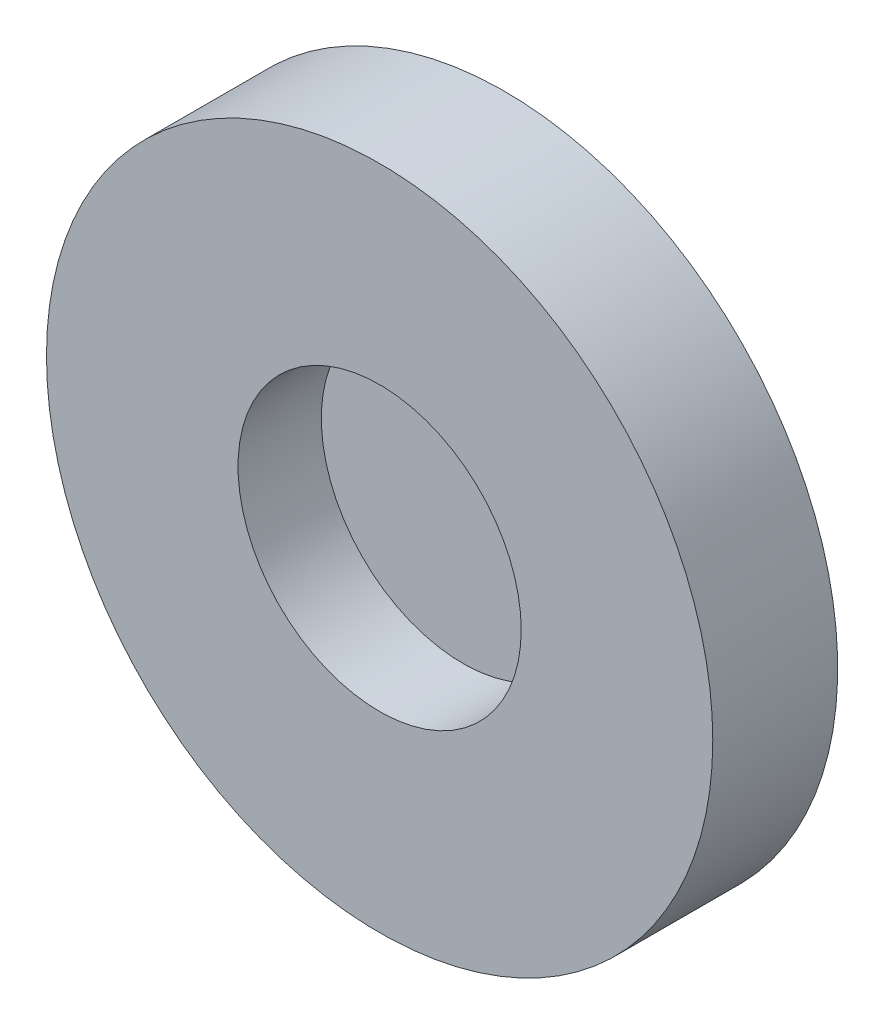
ISO-10303-21;
HEADER;
FILE_DESCRIPTION(('STEP AP214'),'2;1');
FILE_NAME('part.step','',(''),(''),'','','');
FILE_SCHEMA(('AUTOMOTIVE_DESIGN { 1 0 10303 214 1 1 1 1 }'));
ENDSEC;
DATA;
#1=APPLICATION_CONTEXT('core data for automotive mechanical design processes');
#2=APPLICATION_PROTOCOL_DEFINITION('international standard','automotive_design',2000,#1);
#3=PRODUCT_CONTEXT('',#1,'mechanical');
#4=PRODUCT('Part','Part','',(#3));
#5=PRODUCT_RELATED_PRODUCT_CATEGORY('part','',(#4));
#6=PRODUCT_DEFINITION_FORMATION('','',#4);
#7=PRODUCT_DEFINITION_CONTEXT('part definition',#1,'design');
#8=PRODUCT_DEFINITION('design','',#6,#7);
#9=PRODUCT_DEFINITION_SHAPE('','',#8);
#10=(LENGTH_UNIT() NAMED_UNIT(*) SI_UNIT(.MILLI.,.METRE.));
#11=(NAMED_UNIT(*) PLANE_ANGLE_UNIT() SI_UNIT($,.RADIAN.));
#12=(NAMED_UNIT(*) SI_UNIT($,.STERADIAN.) SOLID_ANGLE_UNIT());
#13=UNCERTAINTY_MEASURE_WITH_UNIT(LENGTH_MEASURE(1.E-05),#10,'distance_accuracy_value','');
#14=(GEOMETRIC_REPRESENTATION_CONTEXT(3) GLOBAL_UNCERTAINTY_ASSIGNED_CONTEXT((#13)) GLOBAL_UNIT_ASSIGNED_CONTEXT((#10,
#11,#12)) REPRESENTATION_CONTEXT('',''));
#15=CARTESIAN_POINT('',(0.,0.,0.));
#16=DIRECTION('',(0.,0.,1.));
#17=DIRECTION('',(1.,0.,0.));
#18=AXIS2_PLACEMENT_3D('',#15,#16,#17);
#19=CARTESIAN_POINT('',(0.,0.,1.));
#20=DIRECTION('',(0.,0.,1.));
#21=DIRECTION('',(1.,0.,0.));
#22=AXIS2_PLACEMENT_3D('',#19,#20,#21);
#23=PLANE('',#22);
#24=CARTESIAN_POINT('',(0.,0.,1.));
#25=DIRECTION('',(0.,0.,1.));
#26=DIRECTION('',(1.,0.,0.));
#27=AXIS2_PLACEMENT_3D('',#24,#25,#26);
#28=CIRCLE('',#27,4.);
#29=CARTESIAN_POINT('',(4.,0.,1.));
#30=VERTEX_POINT('',#29);
#31=EDGE_CURVE('E10',#30,#30,#28,.T.);
#32=ORIENTED_EDGE('',*,*,#31,.T.);
#33=EDGE_LOOP('',(#32));
#34=FACE_BOUND('',#33,.T.);
#35=CARTESIAN_POINT('',(0.,0.,1.));
#36=DIRECTION('',(0.,0.,1.));
#37=DIRECTION('',(1.,0.,0.));
#38=AXIS2_PLACEMENT_3D('',#35,#36,#37);
#39=CIRCLE('',#38,1.7);
#40=CARTESIAN_POINT('',(1.7,0.,1.));
#41=VERTEX_POINT('',#40);
#42=EDGE_CURVE('E37',#41,#41,#39,.T.);
#43=ORIENTED_EDGE('',*,*,#42,.F.);
#44=EDGE_LOOP('',(#43));
#45=FACE_BOUND('',#44,.T.);
#46=ADVANCED_FACE('F30',(#34,#45),#23,.T.);
#47=CARTESIAN_POINT('',(0.,0.,1.));
#48=DIRECTION('',(0.,0.,-1.));
#49=DIRECTION('',(-1.,0.,0.));
#50=AXIS2_PLACEMENT_3D('',#47,#48,#49);
#51=CYLINDRICAL_SURFACE('',#50,4.);
#52=ORIENTED_EDGE('',*,*,#31,.F.);
#53=EDGE_LOOP('',(#52));
#54=FACE_BOUND('',#53,.T.);
#55=CARTESIAN_POINT('',(0.,0.,-0.5));
#56=DIRECTION('',(0.,0.,-1.));
#57=DIRECTION('',(-1.,0.,0.));
#58=AXIS2_PLACEMENT_3D('',#55,#56,#57);
#59=CIRCLE('',#58,4.);
#60=CARTESIAN_POINT('',(-4.,0.,-0.5));
#61=VERTEX_POINT('',#60);
#62=EDGE_CURVE('E46',#61,#61,#59,.T.);
#63=ORIENTED_EDGE('',*,*,#62,.F.);
#64=EDGE_LOOP('',(#63));
#65=FACE_BOUND('',#64,.T.);
#66=ADVANCED_FACE('F32',(#54,#65),#51,.T.);
#67=CARTESIAN_POINT('',(0.,0.,1.));
#68=DIRECTION('',(0.,0.,-1.));
#69=DIRECTION('',(-1.,0.,0.));
#70=AXIS2_PLACEMENT_3D('',#67,#68,#69);
#71=CYLINDRICAL_SURFACE('',#70,1.7);
#72=ORIENTED_EDGE('',*,*,#42,.T.);
#73=EDGE_LOOP('',(#72));
#74=FACE_BOUND('',#73,.T.);
#75=CARTESIAN_POINT('',(0.,0.,0.));
#76=DIRECTION('',(0.,0.,1.));
#77=DIRECTION('',(1.,0.,0.));
#78=AXIS2_PLACEMENT_3D('',#75,#76,#77);
#79=CIRCLE('',#78,1.7);
#80=CARTESIAN_POINT('',(1.7,0.,0.));
#81=VERTEX_POINT('',#80);
#82=EDGE_CURVE('E41',#81,#81,#79,.T.);
#83=ORIENTED_EDGE('',*,*,#82,.F.);
#84=EDGE_LOOP('',(#83));
#85=FACE_BOUND('',#84,.T.);
#86=ADVANCED_FACE('F54',(#74,#85),#71,.F.);
#87=CARTESIAN_POINT('',(0.,0.,0.));
#88=DIRECTION('',(0.,0.,-1.));
#89=DIRECTION('',(-1.,0.,0.));
#90=AXIS2_PLACEMENT_3D('',#87,#88,#89);
#91=PLANE('',#90);
#92=ORIENTED_EDGE('',*,*,#82,.T.);
#93=EDGE_LOOP('',(#92));
#94=FACE_BOUND('',#93,.T.);
#95=ADVANCED_FACE('F60',(#94),#91,.F.);
#96=CARTESIAN_POINT('',(0.,0.,-0.5));
#97=DIRECTION('',(0.,0.,-1.));
#98=DIRECTION('',(-1.,0.,0.));
#99=AXIS2_PLACEMENT_3D('',#96,#97,#98);
#100=PLANE('',#99);
#101=ORIENTED_EDGE('',*,*,#62,.T.);
#102=EDGE_LOOP('',(#101));
#103=FACE_BOUND('',#102,.T.);
#104=ADVANCED_FACE('F51',(#103),#100,.T.);
#105=CLOSED_SHELL('',(#46,#66,#86,#95,#104));
#106=MANIFOLD_SOLID_BREP('B2',#105);
#107=ADVANCED_BREP_SHAPE_REPRESENTATION('',(#18,#106),#14);
#108=SHAPE_DEFINITION_REPRESENTATION(#9,#107);
ENDSEC;
END-ISO-10303-21;
